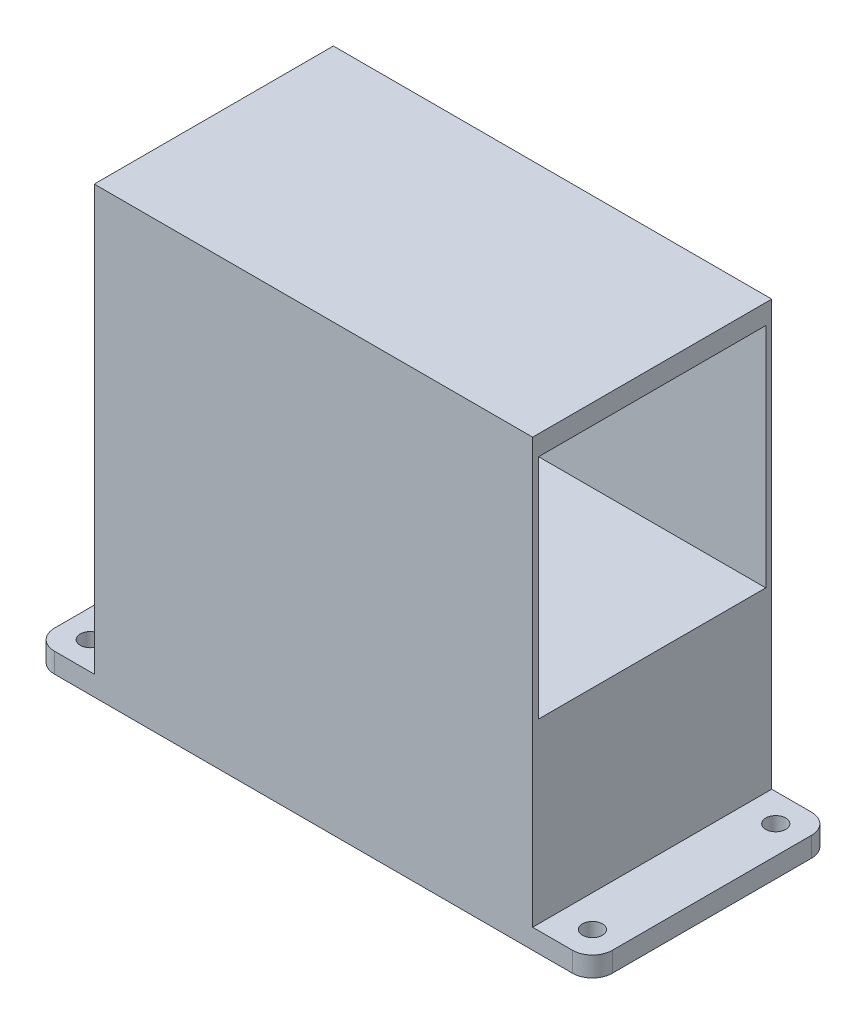
ISO-10303-21;
HEADER;
FILE_DESCRIPTION(('STEP AP214'),'2;1');
FILE_NAME('part.step','',(''),(''),'','','');
FILE_SCHEMA(('AUTOMOTIVE_DESIGN { 1 0 10303 214 1 1 1 1 }'));
ENDSEC;
DATA;
#1=APPLICATION_CONTEXT('core data for automotive mechanical design processes');
#2=APPLICATION_PROTOCOL_DEFINITION('international standard','automotive_design',2000,#1);
#3=PRODUCT_CONTEXT('',#1,'mechanical');
#4=PRODUCT('Part','Part','',(#3));
#5=PRODUCT_RELATED_PRODUCT_CATEGORY('part','',(#4));
#6=PRODUCT_DEFINITION_FORMATION('','',#4);
#7=PRODUCT_DEFINITION_CONTEXT('part definition',#1,'design');
#8=PRODUCT_DEFINITION('design','',#6,#7);
#9=PRODUCT_DEFINITION_SHAPE('','',#8);
#10=(LENGTH_UNIT() NAMED_UNIT(*) SI_UNIT(.MILLI.,.METRE.));
#11=(NAMED_UNIT(*) PLANE_ANGLE_UNIT() SI_UNIT($,.RADIAN.));
#12=(NAMED_UNIT(*) SI_UNIT($,.STERADIAN.) SOLID_ANGLE_UNIT());
#13=UNCERTAINTY_MEASURE_WITH_UNIT(LENGTH_MEASURE(1.E-05),#10,'distance_accuracy_value','');
#14=(GEOMETRIC_REPRESENTATION_CONTEXT(3) GLOBAL_UNCERTAINTY_ASSIGNED_CONTEXT((#13)) GLOBAL_UNIT_ASSIGNED_CONTEXT((#10,
#11,#12)) REPRESENTATION_CONTEXT('',''));
#15=CARTESIAN_POINT('',(0.,0.,0.));
#16=DIRECTION('',(0.,0.,1.));
#17=DIRECTION('',(1.,0.,0.));
#18=AXIS2_PLACEMENT_3D('',#15,#16,#17);
#19=CARTESIAN_POINT('',(0.,5.,0.));
#20=DIRECTION('',(0.,1.,0.));
#21=DIRECTION('',(0.,0.,1.));
#22=AXIS2_PLACEMENT_3D('',#19,#20,#21);
#23=PLANE('',#22);
#24=CARTESIAN_POINT('',(63.,5.,-22.9999999999999));
#25=DIRECTION('',(0.,1.,0.));
#26=DIRECTION('',(0.,0.,1.));
#27=AXIS2_PLACEMENT_3D('',#24,#25,#26);
#28=CIRCLE('',#27,2.49999999999999);
#29=CARTESIAN_POINT('',(63.,5.,-20.4999999999999));
#30=VERTEX_POINT('',#29);
#31=EDGE_CURVE('E490',#30,#30,#28,.T.);
#32=ORIENTED_EDGE('',*,*,#31,.F.);
#33=EDGE_LOOP('',(#32));
#34=FACE_BOUND('',#33,.T.);
#35=CARTESIAN_POINT('',(63.,5.,23.0000000000001));
#36=DIRECTION('',(0.,1.,0.));
#37=DIRECTION('',(0.,0.,1.));
#38=AXIS2_PLACEMENT_3D('',#35,#36,#37);
#39=CIRCLE('',#38,2.49999999999999);
#40=CARTESIAN_POINT('',(63.,5.,25.5000000000001));
#41=VERTEX_POINT('',#40);
#42=EDGE_CURVE('E482',#41,#41,#39,.T.);
#43=ORIENTED_EDGE('',*,*,#42,.F.);
#44=EDGE_LOOP('',(#43));
#45=FACE_BOUND('',#44,.T.);
#46=DIRECTION('',(0.,0.,-1.));
#47=VECTOR('',#46,1.);
#48=CARTESIAN_POINT('',(70.,5.,-30.));
#49=LINE('',#48,#47);
#50=CARTESIAN_POINT('',(69.9999999999989,5.,25.0000000000001));
#51=VERTEX_POINT('',#50);
#52=CARTESIAN_POINT('',(69.9999999999989,5.,-24.9999999999999));
#53=VERTEX_POINT('',#52);
#54=EDGE_CURVE('E249',#51,#53,#49,.T.);
#55=ORIENTED_EDGE('',*,*,#54,.T.);
#56=CARTESIAN_POINT('',(64.9999999999989,5.,-24.9999999999999));
#57=DIRECTION('',(0.,1.,0.));
#58=DIRECTION('',(0.,0.,1.));
#59=AXIS2_PLACEMENT_3D('',#56,#57,#58);
#60=CIRCLE('',#59,5.);
#61=CARTESIAN_POINT('',(65.,5.,-30.));
#62=VERTEX_POINT('',#61);
#63=EDGE_CURVE('E309',#53,#62,#60,.T.);
#64=ORIENTED_EDGE('',*,*,#63,.T.);
#65=DIRECTION('',(-1.,0.,0.));
#66=VECTOR('',#65,1.);
#67=CARTESIAN_POINT('',(-70.,5.,-29.9999999999956));
#68=LINE('',#67,#66);
#69=CARTESIAN_POINT('',(55.,4.99999999999989,-29.9999999999956));
#70=VERTEX_POINT('',#69);
#71=EDGE_CURVE('E255',#62,#70,#68,.T.);
#72=ORIENTED_EDGE('',*,*,#71,.T.);
#73=DIRECTION('',(0.,0.,-1.));
#74=VECTOR('',#73,1.);
#75=CARTESIAN_POINT('',(55.,5.,30.0000000000045));
#76=LINE('',#75,#74);
#77=CARTESIAN_POINT('',(55.,5.,30.0000000000045));
#78=VERTEX_POINT('',#77);
#79=EDGE_CURVE('E211',#78,#70,#76,.T.);
#80=ORIENTED_EDGE('',*,*,#79,.F.);
#81=DIRECTION('',(1.,0.,0.));
#82=VECTOR('',#81,1.);
#83=CARTESIAN_POINT('',(-70.0000000000011,5.,30.0000000000045));
#84=LINE('',#83,#82);
#85=CARTESIAN_POINT('',(65.,5.,30.));
#86=VERTEX_POINT('',#85);
#87=EDGE_CURVE('E262',#78,#86,#84,.T.);
#88=ORIENTED_EDGE('',*,*,#87,.T.);
#89=CARTESIAN_POINT('',(64.9999999999989,5.,24.9999999999999));
#90=DIRECTION('',(0.,1.,0.));
#91=DIRECTION('',(0.,0.,1.));
#92=AXIS2_PLACEMENT_3D('',#89,#90,#91);
#93=CIRCLE('',#92,5.);
#94=EDGE_CURVE('E306',#86,#51,#93,.T.);
#95=ORIENTED_EDGE('',*,*,#94,.T.);
#96=EDGE_LOOP('',(#55,#64,#72,#80,#88,#95));
#97=FACE_BOUND('',#96,.T.);
#98=ADVANCED_FACE('F49',(#34,#45,#97),#23,.T.);
#99=CARTESIAN_POINT('',(70.,5.,-30.));
#100=DIRECTION('',(-1.,0.,0.));
#101=DIRECTION('',(0.,0.,1.));
#102=AXIS2_PLACEMENT_3D('',#99,#100,#101);
#103=PLANE('',#102);
#104=DIRECTION('',(0.,0.,-1.));
#105=VECTOR('',#104,1.);
#106=CARTESIAN_POINT('',(70.,0.,-30.));
#107=LINE('',#106,#105);
#108=CARTESIAN_POINT('',(70.,0.,24.9999999999999));
#109=VERTEX_POINT('',#108);
#110=CARTESIAN_POINT('',(70.,0.,-25.0000000000001));
#111=VERTEX_POINT('',#110);
#112=EDGE_CURVE('E248',#109,#111,#107,.T.);
#113=ORIENTED_EDGE('',*,*,#112,.T.);
#114=DIRECTION('',(0.,-1.,0.));
#115=VECTOR('',#114,1.);
#116=CARTESIAN_POINT('',(69.9999999999989,5.,-24.9999999999999));
#117=LINE('',#116,#115);
#118=EDGE_CURVE('E303',#111,#53,#117,.F.);
#119=ORIENTED_EDGE('',*,*,#118,.T.);
#120=ORIENTED_EDGE('',*,*,#54,.F.);
#121=DIRECTION('',(0.,-1.,0.));
#122=VECTOR('',#121,1.);
#123=CARTESIAN_POINT('',(69.9999999999989,5.,25.0000000000001));
#124=LINE('',#123,#122);
#125=EDGE_CURVE('E299',#51,#109,#124,.T.);
#126=ORIENTED_EDGE('',*,*,#125,.T.);
#127=EDGE_LOOP('',(#113,#119,#120,#126));
#128=FACE_BOUND('',#127,.T.);
#129=ADVANCED_FACE('F354',(#128),#103,.F.);
#130=CARTESIAN_POINT('',(-70.,5.,-29.9999999999956));
#131=DIRECTION('',(0.,0.,1.));
#132=DIRECTION('',(1.,0.,0.));
#133=AXIS2_PLACEMENT_3D('',#130,#131,#132);
#134=PLANE('',#133);
#135=ORIENTED_EDGE('',*,*,#71,.F.);
#136=DIRECTION('',(0.,-1.,0.));
#137=VECTOR('',#136,1.);
#138=CARTESIAN_POINT('',(65.,5.,-30.));
#139=LINE('',#138,#137);
#140=CARTESIAN_POINT('',(65.,0.,-30.));
#141=VERTEX_POINT('',#140);
#142=EDGE_CURVE('E283',#62,#141,#139,.T.);
#143=ORIENTED_EDGE('',*,*,#142,.T.);
#144=DIRECTION('',(-1.,0.,0.));
#145=VECTOR('',#144,1.);
#146=CARTESIAN_POINT('',(-70.0000000000006,0.,-30.));
#147=LINE('',#146,#145);
#148=CARTESIAN_POINT('',(-65.0000000000006,0.,-30.0000000000042));
#149=VERTEX_POINT('',#148);
#150=EDGE_CURVE('E270',#141,#149,#147,.T.);
#151=ORIENTED_EDGE('',*,*,#150,.T.);
#152=DIRECTION('',(0.,-1.,0.));
#153=VECTOR('',#152,1.);
#154=CARTESIAN_POINT('',(-65.,5.,-30.));
#155=LINE('',#154,#153);
#156=CARTESIAN_POINT('',(-65.,5.,-30.));
#157=VERTEX_POINT('',#156);
#158=EDGE_CURVE('E266',#149,#157,#155,.F.);
#159=ORIENTED_EDGE('',*,*,#158,.T.);
#160=CARTESIAN_POINT('',(-55.0000000000005,5.,-30.));
#161=VERTEX_POINT('',#160);
#162=EDGE_CURVE('E253',#161,#157,#68,.T.);
#163=ORIENTED_EDGE('',*,*,#162,.F.);
#164=DIRECTION('',(0.,-1.,0.));
#165=VECTOR('',#164,1.);
#166=CARTESIAN_POINT('',(-55.0000000000006,111.5,-30.));
#167=LINE('',#166,#165);
#168=CARTESIAN_POINT('',(-55.0000000000006,111.5,-30.));
#169=VERTEX_POINT('',#168);
#170=EDGE_CURVE('E240',#169,#161,#167,.T.);
#171=ORIENTED_EDGE('',*,*,#170,.F.);
#172=DIRECTION('',(-1.,0.,0.));
#173=VECTOR('',#172,1.);
#174=CARTESIAN_POINT('',(-55.0000000000006,111.5,-30.));
#175=LINE('',#174,#173);
#176=CARTESIAN_POINT('',(54.9999999999989,111.5,-29.9999999999956));
#177=VERTEX_POINT('',#176);
#178=EDGE_CURVE('E216',#177,#169,#175,.T.);
#179=ORIENTED_EDGE('',*,*,#178,.F.);
#180=DIRECTION('',(0.,-1.,0.));
#181=VECTOR('',#180,1.);
#182=CARTESIAN_POINT('',(54.9999999999989,111.5,-29.9999999999956));
#183=LINE('',#182,#181);
#184=EDGE_CURVE('E244',#177,#70,#183,.T.);
#185=ORIENTED_EDGE('',*,*,#184,.T.);
#186=EDGE_LOOP('',(#135,#143,#151,#159,#163,#171,#179,#185));
#187=FACE_BOUND('',#186,.T.);
#188=ADVANCED_FACE('F346',(#187),#134,.F.);
#189=CARTESIAN_POINT('',(-70.,5.,-29.9999999999956));
#190=DIRECTION('',(1.,0.,0.));
#191=DIRECTION('',(0.,0.,-1.));
#192=AXIS2_PLACEMENT_3D('',#189,#190,#191);
#193=PLANE('',#192);
#194=DIRECTION('',(0.,0.,1.));
#195=VECTOR('',#194,1.);
#196=CARTESIAN_POINT('',(-70.0000000000006,0.,-30.));
#197=LINE('',#196,#195);
#198=CARTESIAN_POINT('',(-70.0000000000006,0.,-24.9999999999999));
#199=VERTEX_POINT('',#198);
#200=CARTESIAN_POINT('',(-70.0000000000011,0.,25.0000000000001));
#201=VERTEX_POINT('',#200);
#202=EDGE_CURVE('E274',#199,#201,#197,.T.);
#203=ORIENTED_EDGE('',*,*,#202,.T.);
#204=DIRECTION('',(0.,-1.,0.));
#205=VECTOR('',#204,1.);
#206=CARTESIAN_POINT('',(-70.0000000000011,5.,25.0000000000044));
#207=LINE('',#206,#205);
#208=CARTESIAN_POINT('',(-70.0000000000011,5.,25.0000000000044));
#209=VERTEX_POINT('',#208);
#210=EDGE_CURVE('E323',#201,#209,#207,.F.);
#211=ORIENTED_EDGE('',*,*,#210,.T.);
#212=DIRECTION('',(0.,0.,1.));
#213=VECTOR('',#212,1.);
#214=CARTESIAN_POINT('',(-70.,5.,-29.9999999999956));
#215=LINE('',#214,#213);
#216=CARTESIAN_POINT('',(-70.,5.,-24.9999999999957));
#217=VERTEX_POINT('',#216);
#218=EDGE_CURVE('E258',#217,#209,#215,.T.);
#219=ORIENTED_EDGE('',*,*,#218,.F.);
#220=DIRECTION('',(0.,-1.,0.));
#221=VECTOR('',#220,1.);
#222=CARTESIAN_POINT('',(-70.,5.,-24.9999999999957));
#223=LINE('',#222,#221);
#224=EDGE_CURVE('E319',#217,#199,#223,.T.);
#225=ORIENTED_EDGE('',*,*,#224,.T.);
#226=EDGE_LOOP('',(#203,#211,#219,#225));
#227=FACE_BOUND('',#226,.T.);
#228=ADVANCED_FACE('F338',(#227),#193,.F.);
#229=CARTESIAN_POINT('',(-70.0000000000011,5.,30.0000000000045));
#230=DIRECTION('',(0.,0.,-1.));
#231=DIRECTION('',(-1.,0.,0.));
#232=AXIS2_PLACEMENT_3D('',#229,#230,#231);
#233=PLANE('',#232);
#234=DIRECTION('',(1.,0.,0.));
#235=VECTOR('',#234,1.);
#236=CARTESIAN_POINT('',(-70.0000000000011,0.,30.));
#237=LINE('',#236,#235);
#238=CARTESIAN_POINT('',(-65.0000000000011,0.,29.9999999999956));
#239=VERTEX_POINT('',#238);
#240=CARTESIAN_POINT('',(65.,0.,29.9999999999998));
#241=VERTEX_POINT('',#240);
#242=EDGE_CURVE('E254',#239,#241,#237,.T.);
#243=ORIENTED_EDGE('',*,*,#242,.T.);
#244=DIRECTION('',(0.,-1.,0.));
#245=VECTOR('',#244,1.);
#246=CARTESIAN_POINT('',(65.,5.,30.));
#247=LINE('',#246,#245);
#248=EDGE_CURVE('E316',#241,#86,#247,.F.);
#249=ORIENTED_EDGE('',*,*,#248,.T.);
#250=ORIENTED_EDGE('',*,*,#87,.F.);
#251=DIRECTION('',(0.,-1.,0.));
#252=VECTOR('',#251,1.);
#253=CARTESIAN_POINT('',(55.,111.5,30.0000000000045));
#254=LINE('',#253,#252);
#255=CARTESIAN_POINT('',(55.,111.5,30.0000000000045));
#256=VERTEX_POINT('',#255);
#257=EDGE_CURVE('E226',#256,#78,#254,.T.);
#258=ORIENTED_EDGE('',*,*,#257,.F.);
#259=DIRECTION('',(1.,0.,0.));
#260=VECTOR('',#259,1.);
#261=CARTESIAN_POINT('',(-55.0000000000011,111.5,30.));
#262=LINE('',#261,#260);
#263=CARTESIAN_POINT('',(-55.0000000000011,111.5,30.));
#264=VERTEX_POINT('',#263);
#265=EDGE_CURVE('E223',#264,#256,#262,.T.);
#266=ORIENTED_EDGE('',*,*,#265,.F.);
#267=DIRECTION('',(0.,-1.,0.));
#268=VECTOR('',#267,1.);
#269=CARTESIAN_POINT('',(-55.0000000000011,111.5,30.));
#270=LINE('',#269,#268);
#271=CARTESIAN_POINT('',(-55.0000000000006,4.99999999999995,30.));
#272=VERTEX_POINT('',#271);
#273=EDGE_CURVE('E236',#264,#272,#270,.T.);
#274=ORIENTED_EDGE('',*,*,#273,.T.);
#275=CARTESIAN_POINT('',(-65.0000000000011,5.,30.));
#276=VERTEX_POINT('',#275);
#277=EDGE_CURVE('E263',#276,#272,#84,.T.);
#278=ORIENTED_EDGE('',*,*,#277,.F.);
#279=DIRECTION('',(0.,-1.,0.));
#280=VECTOR('',#279,1.);
#281=CARTESIAN_POINT('',(-65.0000000000011,5.,30.));
#282=LINE('',#281,#280);
#283=EDGE_CURVE('E312',#276,#239,#282,.T.);
#284=ORIENTED_EDGE('',*,*,#283,.T.);
#285=EDGE_LOOP('',(#243,#249,#250,#258,#266,#274,#278,#284));
#286=FACE_BOUND('',#285,.T.);
#287=ADVANCED_FACE('F363',(#286),#233,.F.);
#288=CARTESIAN_POINT('',(-62.9999999999999,5.,23.0000000000046));
#289=DIRECTION('',(0.,1.,0.));
#290=DIRECTION('',(0.,0.,1.));
#291=AXIS2_PLACEMENT_3D('',#288,#289,#290);
#292=CIRCLE('',#291,2.49999999999999);
#293=CARTESIAN_POINT('',(-62.9999999999999,5.,25.5000000000046));
#294=VERTEX_POINT('',#293);
#295=EDGE_CURVE('E455',#294,#294,#292,.T.);
#296=ORIENTED_EDGE('',*,*,#295,.F.);
#297=EDGE_LOOP('',(#296));
#298=FACE_BOUND('',#297,.T.);
#299=CARTESIAN_POINT('',(-63.0000000000011,5.,-22.9999999999955));
#300=DIRECTION('',(0.,1.,0.));
#301=DIRECTION('',(0.,0.,1.));
#302=AXIS2_PLACEMENT_3D('',#299,#300,#301);
#303=CIRCLE('',#302,2.49999999999999);
#304=CARTESIAN_POINT('',(-63.0000000000011,5.,-20.4999999999955));
#305=VERTEX_POINT('',#304);
#306=EDGE_CURVE('E458',#305,#305,#303,.T.);
#307=ORIENTED_EDGE('',*,*,#306,.F.);
#308=EDGE_LOOP('',(#307));
#309=FACE_BOUND('',#308,.T.);
#310=ORIENTED_EDGE('',*,*,#218,.T.);
#311=CARTESIAN_POINT('',(-65.0000000000011,5.,24.9999999999999));
#312=DIRECTION('',(0.,1.,0.));
#313=DIRECTION('',(0.,0.,1.));
#314=AXIS2_PLACEMENT_3D('',#311,#312,#313);
#315=CIRCLE('',#314,5.);
#316=EDGE_CURVE('E11',#209,#276,#315,.T.);
#317=ORIENTED_EDGE('',*,*,#316,.T.);
#318=ORIENTED_EDGE('',*,*,#277,.T.);
#319=DIRECTION('',(0.,0.,1.));
#320=VECTOR('',#319,1.);
#321=CARTESIAN_POINT('',(-55.0000000000006,4.99999999999995,30.));
#322=LINE('',#321,#320);
#323=EDGE_CURVE('E217',#161,#272,#322,.T.);
#324=ORIENTED_EDGE('',*,*,#323,.F.);
#325=ORIENTED_EDGE('',*,*,#162,.T.);
#326=CARTESIAN_POINT('',(-65.,5.,-25.0000000000001));
#327=DIRECTION('',(0.,1.,0.));
#328=DIRECTION('',(0.,0.,1.));
#329=AXIS2_PLACEMENT_3D('',#326,#327,#328);
#330=CIRCLE('',#329,5.);
#331=EDGE_CURVE('E58',#157,#217,#330,.T.);
#332=ORIENTED_EDGE('',*,*,#331,.T.);
#333=EDGE_LOOP('',(#310,#317,#318,#324,#325,#332));
#334=FACE_BOUND('',#333,.T.);
#335=ADVANCED_FACE('F331',(#298,#309,#334),#23,.T.);
#336=CARTESIAN_POINT('',(0.,0.,0.));
#337=DIRECTION('',(0.,1.,0.));
#338=DIRECTION('',(0.,0.,1.));
#339=AXIS2_PLACEMENT_3D('',#336,#337,#338);
#340=PLANE('',#339);
#341=CARTESIAN_POINT('',(63.,0.,-23.0000000000001));
#342=DIRECTION('',(0.,1.,0.));
#343=DIRECTION('',(0.,0.,1.));
#344=AXIS2_PLACEMENT_3D('',#341,#342,#343);
#345=CIRCLE('',#344,2.5);
#346=CARTESIAN_POINT('',(63.,0.,-20.5000000000001));
#347=VERTEX_POINT('',#346);
#348=EDGE_CURVE('E486',#347,#347,#345,.T.);
#349=ORIENTED_EDGE('',*,*,#348,.T.);
#350=EDGE_LOOP('',(#349));
#351=FACE_BOUND('',#350,.T.);
#352=CARTESIAN_POINT('',(63.,0.,22.9999999999999));
#353=DIRECTION('',(0.,1.,0.));
#354=DIRECTION('',(0.,0.,1.));
#355=AXIS2_PLACEMENT_3D('',#352,#353,#354);
#356=CIRCLE('',#355,2.5);
#357=CARTESIAN_POINT('',(63.,0.,25.4999999999999));
#358=VERTEX_POINT('',#357);
#359=EDGE_CURVE('E478',#358,#358,#356,.T.);
#360=ORIENTED_EDGE('',*,*,#359,.T.);
#361=EDGE_LOOP('',(#360));
#362=FACE_BOUND('',#361,.T.);
#363=CARTESIAN_POINT('',(-63.0000000000005,0.,23.0000000000001));
#364=DIRECTION('',(0.,1.,0.));
#365=DIRECTION('',(0.,0.,1.));
#366=AXIS2_PLACEMENT_3D('',#363,#364,#365);
#367=CIRCLE('',#366,2.5);
#368=CARTESIAN_POINT('',(-63.0000000000005,0.,25.5000000000001));
#369=VERTEX_POINT('',#368);
#370=EDGE_CURVE('E462',#369,#369,#367,.T.);
#371=ORIENTED_EDGE('',*,*,#370,.T.);
#372=EDGE_LOOP('',(#371));
#373=FACE_BOUND('',#372,.T.);
#374=CARTESIAN_POINT('',(-63.0000000000011,0.,-22.9999999999999));
#375=DIRECTION('',(0.,1.,0.));
#376=DIRECTION('',(0.,0.,1.));
#377=AXIS2_PLACEMENT_3D('',#374,#375,#376);
#378=CIRCLE('',#377,2.5);
#379=CARTESIAN_POINT('',(-63.0000000000011,0.,-20.4999999999999));
#380=VERTEX_POINT('',#379);
#381=EDGE_CURVE('E461',#380,#380,#378,.T.);
#382=ORIENTED_EDGE('',*,*,#381,.T.);
#383=EDGE_LOOP('',(#382));
#384=FACE_BOUND('',#383,.T.);
#385=ORIENTED_EDGE('',*,*,#150,.F.);
#386=CARTESIAN_POINT('',(64.9999999999999,0.,-25.0000000000001));
#387=DIRECTION('',(0.,1.,0.));
#388=DIRECTION('',(0.,0.,1.));
#389=AXIS2_PLACEMENT_3D('',#386,#387,#388);
#390=CIRCLE('',#389,5.);
#391=EDGE_CURVE('E296',#141,#111,#390,.F.);
#392=ORIENTED_EDGE('',*,*,#391,.T.);
#393=ORIENTED_EDGE('',*,*,#112,.F.);
#394=CARTESIAN_POINT('',(65.,0.,24.9999999999999));
#395=DIRECTION('',(0.,1.,0.));
#396=DIRECTION('',(0.,0.,1.));
#397=AXIS2_PLACEMENT_3D('',#394,#395,#396);
#398=CIRCLE('',#397,5.);
#399=EDGE_CURVE('E293',#109,#241,#398,.F.);
#400=ORIENTED_EDGE('',*,*,#399,.T.);
#401=ORIENTED_EDGE('',*,*,#242,.F.);
#402=CARTESIAN_POINT('',(-65.0000000000011,0.,24.9999999999957));
#403=DIRECTION('',(0.,1.,0.));
#404=DIRECTION('',(0.,0.,1.));
#405=AXIS2_PLACEMENT_3D('',#402,#403,#404);
#406=CIRCLE('',#405,5.);
#407=EDGE_CURVE('E290',#239,#201,#406,.F.);
#408=ORIENTED_EDGE('',*,*,#407,.T.);
#409=ORIENTED_EDGE('',*,*,#202,.F.);
#410=CARTESIAN_POINT('',(-65.0000000000006,0.,-25.0000000000044));
#411=DIRECTION('',(0.,1.,0.));
#412=DIRECTION('',(0.,0.,1.));
#413=AXIS2_PLACEMENT_3D('',#410,#411,#412);
#414=CIRCLE('',#413,5.);
#415=EDGE_CURVE('E287',#199,#149,#414,.F.);
#416=ORIENTED_EDGE('',*,*,#415,.T.);
#417=EDGE_LOOP('',(#385,#392,#393,#400,#401,#408,#409,#416));
#418=FACE_BOUND('',#417,.T.);
#419=ADVANCED_FACE('F343',(#351,#362,#373,#384,#418),#340,.F.);
#420=CARTESIAN_POINT('',(55.,111.5,30.0000000000045));
#421=DIRECTION('',(-1.,0.,0.));
#422=DIRECTION('',(0.,0.,1.));
#423=AXIS2_PLACEMENT_3D('',#420,#421,#422);
#424=PLANE('',#423);
#425=DIRECTION('',(0.,0.,1.));
#426=VECTOR('',#425,1.);
#427=CARTESIAN_POINT('',(54.9999999999989,49.5,30.0000000000045));
#428=LINE('',#427,#426);
#429=CARTESIAN_POINT('',(54.9999999999989,49.5,-28.4999999999958));
#430=VERTEX_POINT('',#429);
#431=CARTESIAN_POINT('',(54.9999999999989,49.5,28.5000000000044));
#432=VERTEX_POINT('',#431);
#433=EDGE_CURVE('E203',#430,#432,#428,.T.);
#434=ORIENTED_EDGE('',*,*,#433,.T.);
#435=DIRECTION('',(0.,1.,0.));
#436=VECTOR('',#435,1.);
#437=CARTESIAN_POINT('',(54.9999999999989,111.5,28.5000000000044));
#438=LINE('',#437,#436);
#439=CARTESIAN_POINT('',(54.9999999999989,106.5,28.5000000000044));
#440=VERTEX_POINT('',#439);
#441=EDGE_CURVE('E207',#432,#440,#438,.T.);
#442=ORIENTED_EDGE('',*,*,#441,.T.);
#443=DIRECTION('',(0.,0.,-1.));
#444=VECTOR('',#443,1.);
#445=CARTESIAN_POINT('',(55.,106.5,30.0000000000042));
#446=LINE('',#445,#444);
#447=CARTESIAN_POINT('',(54.9999999999989,106.5,-28.4999999999958));
#448=VERTEX_POINT('',#447);
#449=EDGE_CURVE('E194',#440,#448,#446,.T.);
#450=ORIENTED_EDGE('',*,*,#449,.T.);
#451=DIRECTION('',(0.,-1.,0.));
#452=VECTOR('',#451,1.);
#453=CARTESIAN_POINT('',(54.9999999999989,111.5,-28.4999999999955));
#454=LINE('',#453,#452);
#455=EDGE_CURVE('E168',#448,#430,#454,.T.);
#456=ORIENTED_EDGE('',*,*,#455,.T.);
#457=EDGE_LOOP('',(#434,#442,#450,#456));
#458=FACE_BOUND('',#457,.T.);
#459=ORIENTED_EDGE('',*,*,#79,.T.);
#460=ORIENTED_EDGE('',*,*,#184,.F.);
#461=DIRECTION('',(0.,0.,-1.));
#462=VECTOR('',#461,1.);
#463=CARTESIAN_POINT('',(55.,111.5,30.0000000000045));
#464=LINE('',#463,#462);
#465=EDGE_CURVE('E212',#256,#177,#464,.T.);
#466=ORIENTED_EDGE('',*,*,#465,.F.);
#467=ORIENTED_EDGE('',*,*,#257,.T.);
#468=EDGE_LOOP('',(#459,#460,#466,#467));
#469=FACE_BOUND('',#468,.T.);
#470=ADVANCED_FACE('F426',(#458,#469),#424,.F.);
#471=CARTESIAN_POINT('',(-55.0000000000011,111.5,30.));
#472=DIRECTION('',(1.,0.,0.));
#473=DIRECTION('',(0.,0.,-1.));
#474=AXIS2_PLACEMENT_3D('',#471,#472,#473);
#475=PLANE('',#474);
#476=DIRECTION('',(0.,0.,-1.));
#477=VECTOR('',#476,1.);
#478=CARTESIAN_POINT('',(-55.0000000000005,106.5,-28.5));
#479=LINE('',#478,#477);
#480=CARTESIAN_POINT('',(-55.0000000000011,106.5,28.5));
#481=VERTEX_POINT('',#480);
#482=CARTESIAN_POINT('',(-55.0000000000005,106.5,-28.5));
#483=VERTEX_POINT('',#482);
#484=EDGE_CURVE('E175',#481,#483,#479,.T.);
#485=ORIENTED_EDGE('',*,*,#484,.F.);
#486=DIRECTION('',(0.,1.,0.));
#487=VECTOR('',#486,1.);
#488=CARTESIAN_POINT('',(-55.0000000000006,49.5,28.5));
#489=LINE('',#488,#487);
#490=CARTESIAN_POINT('',(-55.0000000000006,49.5,28.5));
#491=VERTEX_POINT('',#490);
#492=EDGE_CURVE('E73',#491,#481,#489,.T.);
#493=ORIENTED_EDGE('',*,*,#492,.F.);
#494=DIRECTION('',(0.,0.,1.));
#495=VECTOR('',#494,1.);
#496=CARTESIAN_POINT('',(-55.0000000000005,49.5,-28.5));
#497=LINE('',#496,#495);
#498=CARTESIAN_POINT('',(-55.0000000000005,49.5,-28.5));
#499=VERTEX_POINT('',#498);
#500=EDGE_CURVE('E183',#499,#491,#497,.T.);
#501=ORIENTED_EDGE('',*,*,#500,.F.);
#502=DIRECTION('',(0.,-1.,0.));
#503=VECTOR('',#502,1.);
#504=CARTESIAN_POINT('',(-55.0000000000005,49.5,-28.5));
#505=LINE('',#504,#503);
#506=EDGE_CURVE('E165',#483,#499,#505,.T.);
#507=ORIENTED_EDGE('',*,*,#506,.F.);
#508=EDGE_LOOP('',(#485,#493,#501,#507));
#509=FACE_BOUND('',#508,.T.);
#510=ORIENTED_EDGE('',*,*,#323,.T.);
#511=ORIENTED_EDGE('',*,*,#273,.F.);
#512=DIRECTION('',(0.,0.,1.));
#513=VECTOR('',#512,1.);
#514=CARTESIAN_POINT('',(-55.0000000000011,111.5,30.));
#515=LINE('',#514,#513);
#516=EDGE_CURVE('E220',#169,#264,#515,.T.);
#517=ORIENTED_EDGE('',*,*,#516,.F.);
#518=ORIENTED_EDGE('',*,*,#170,.T.);
#519=EDGE_LOOP('',(#510,#511,#517,#518));
#520=FACE_BOUND('',#519,.T.);
#521=ADVANCED_FACE('F180',(#509,#520),#475,.F.);
#522=CARTESIAN_POINT('',(-1.11022302462516E-12,111.5,4.44089209850063E-12));
#523=DIRECTION('',(0.,-1.,0.));
#524=DIRECTION('',(0.,0.,-1.));
#525=AXIS2_PLACEMENT_3D('',#522,#523,#524);
#526=PLANE('',#525);
#527=ORIENTED_EDGE('',*,*,#465,.T.);
#528=ORIENTED_EDGE('',*,*,#178,.T.);
#529=ORIENTED_EDGE('',*,*,#516,.T.);
#530=ORIENTED_EDGE('',*,*,#265,.T.);
#531=EDGE_LOOP('',(#527,#528,#529,#530));
#532=FACE_BOUND('',#531,.T.);
#533=ADVANCED_FACE('F377',(#532),#526,.F.);
#534=CARTESIAN_POINT('',(64.9999999999989,5.,-24.9999999999999));
#535=DIRECTION('',(0.,-1.,0.));
#536=DIRECTION('',(0.,0.,-1.));
#537=AXIS2_PLACEMENT_3D('',#534,#535,#536);
#538=CYLINDRICAL_SURFACE('',#537,5.);
#539=ORIENTED_EDGE('',*,*,#63,.F.);
#540=ORIENTED_EDGE('',*,*,#118,.F.);
#541=ORIENTED_EDGE('',*,*,#391,.F.);
#542=ORIENTED_EDGE('',*,*,#142,.F.);
#543=EDGE_LOOP('',(#539,#540,#541,#542));
#544=FACE_BOUND('',#543,.T.);
#545=ADVANCED_FACE('F350',(#544),#538,.T.);
#546=CARTESIAN_POINT('',(64.9999999999989,5.,24.9999999999999));
#547=DIRECTION('',(0.,-1.,0.));
#548=DIRECTION('',(0.,0.,-1.));
#549=AXIS2_PLACEMENT_3D('',#546,#547,#548);
#550=CYLINDRICAL_SURFACE('',#549,5.);
#551=ORIENTED_EDGE('',*,*,#94,.F.);
#552=ORIENTED_EDGE('',*,*,#248,.F.);
#553=ORIENTED_EDGE('',*,*,#399,.F.);
#554=ORIENTED_EDGE('',*,*,#125,.F.);
#555=EDGE_LOOP('',(#551,#552,#553,#554));
#556=FACE_BOUND('',#555,.T.);
#557=ADVANCED_FACE('F359',(#556),#550,.T.);
#558=CARTESIAN_POINT('',(-65.0000000000011,5.,24.9999999999999));
#559=DIRECTION('',(0.,-1.,0.));
#560=DIRECTION('',(0.,0.,-1.));
#561=AXIS2_PLACEMENT_3D('',#558,#559,#560);
#562=CYLINDRICAL_SURFACE('',#561,5.);
#563=ORIENTED_EDGE('',*,*,#316,.F.);
#564=ORIENTED_EDGE('',*,*,#210,.F.);
#565=ORIENTED_EDGE('',*,*,#407,.F.);
#566=ORIENTED_EDGE('',*,*,#283,.F.);
#567=EDGE_LOOP('',(#563,#564,#565,#566));
#568=FACE_BOUND('',#567,.T.);
#569=ADVANCED_FACE('F369',(#568),#562,.T.);
#570=CARTESIAN_POINT('',(-65.,5.,-25.0000000000001));
#571=DIRECTION('',(0.,-1.,0.));
#572=DIRECTION('',(0.,0.,-1.));
#573=AXIS2_PLACEMENT_3D('',#570,#571,#572);
#574=CYLINDRICAL_SURFACE('',#573,5.);
#575=ORIENTED_EDGE('',*,*,#331,.F.);
#576=ORIENTED_EDGE('',*,*,#158,.F.);
#577=ORIENTED_EDGE('',*,*,#415,.F.);
#578=ORIENTED_EDGE('',*,*,#224,.F.);
#579=EDGE_LOOP('',(#575,#576,#577,#578));
#580=FACE_BOUND('',#579,.T.);
#581=ADVANCED_FACE('F51',(#580),#574,.T.);
#582=CARTESIAN_POINT('',(104.999999999999,49.5,28.5));
#583=DIRECTION('',(0.,0.,1.));
#584=DIRECTION('',(1.,0.,0.));
#585=AXIS2_PLACEMENT_3D('',#582,#583,#584);
#586=PLANE('',#585);
#587=DIRECTION('',(-1.,0.,0.));
#588=VECTOR('',#587,1.);
#589=CARTESIAN_POINT('',(104.999999999999,49.5,28.5));
#590=LINE('',#589,#588);
#591=EDGE_CURVE('E191',#432,#491,#590,.T.);
#592=ORIENTED_EDGE('',*,*,#591,.T.);
#593=ORIENTED_EDGE('',*,*,#492,.T.);
#594=DIRECTION('',(-1.,0.,0.));
#595=VECTOR('',#594,1.);
#596=CARTESIAN_POINT('',(105.,106.5,28.5));
#597=LINE('',#596,#595);
#598=EDGE_CURVE('E172',#440,#481,#597,.T.);
#599=ORIENTED_EDGE('',*,*,#598,.F.);
#600=ORIENTED_EDGE('',*,*,#441,.F.);
#601=EDGE_LOOP('',(#592,#593,#599,#600));
#602=FACE_BOUND('',#601,.T.);
#603=ADVANCED_FACE('F519',(#602),#586,.F.);
#604=CARTESIAN_POINT('',(104.999999999998,49.5,-28.5));
#605=DIRECTION('',(0.,-1.,0.));
#606=DIRECTION('',(0.,0.,-1.));
#607=AXIS2_PLACEMENT_3D('',#604,#605,#606);
#608=PLANE('',#607);
#609=DIRECTION('',(-1.,0.,0.));
#610=VECTOR('',#609,1.);
#611=CARTESIAN_POINT('',(104.999999999998,49.5,-28.5));
#612=LINE('',#611,#610);
#613=EDGE_CURVE('E171',#430,#499,#612,.T.);
#614=ORIENTED_EDGE('',*,*,#613,.T.);
#615=ORIENTED_EDGE('',*,*,#500,.T.);
#616=ORIENTED_EDGE('',*,*,#591,.F.);
#617=ORIENTED_EDGE('',*,*,#433,.F.);
#618=EDGE_LOOP('',(#614,#615,#616,#617));
#619=FACE_BOUND('',#618,.T.);
#620=ADVANCED_FACE('F516',(#619),#608,.F.);
#621=CARTESIAN_POINT('',(104.999999999998,49.5,-28.5));
#622=DIRECTION('',(0.,0.,-1.));
#623=DIRECTION('',(-1.,0.,0.));
#624=AXIS2_PLACEMENT_3D('',#621,#622,#623);
#625=PLANE('',#624);
#626=DIRECTION('',(-1.,0.,0.));
#627=VECTOR('',#626,1.);
#628=CARTESIAN_POINT('',(104.999999999999,106.5,-28.5));
#629=LINE('',#628,#627);
#630=EDGE_CURVE('E65',#448,#483,#629,.T.);
#631=ORIENTED_EDGE('',*,*,#630,.T.);
#632=ORIENTED_EDGE('',*,*,#506,.T.);
#633=ORIENTED_EDGE('',*,*,#613,.F.);
#634=ORIENTED_EDGE('',*,*,#455,.F.);
#635=EDGE_LOOP('',(#631,#632,#633,#634));
#636=FACE_BOUND('',#635,.T.);
#637=ADVANCED_FACE('F162',(#636),#625,.F.);
#638=CARTESIAN_POINT('',(104.999999999999,106.5,-28.5));
#639=DIRECTION('',(0.,1.,0.));
#640=DIRECTION('',(0.,0.,1.));
#641=AXIS2_PLACEMENT_3D('',#638,#639,#640);
#642=PLANE('',#641);
#643=ORIENTED_EDGE('',*,*,#598,.T.);
#644=ORIENTED_EDGE('',*,*,#484,.T.);
#645=ORIENTED_EDGE('',*,*,#630,.F.);
#646=ORIENTED_EDGE('',*,*,#449,.F.);
#647=EDGE_LOOP('',(#643,#644,#645,#646));
#648=FACE_BOUND('',#647,.T.);
#649=ADVANCED_FACE('F176',(#648),#642,.F.);
#650=CARTESIAN_POINT('',(-63.0000000000011,5.,-22.9999999999955));
#651=DIRECTION('',(0.,1.,0.));
#652=DIRECTION('',(0.,0.,1.));
#653=AXIS2_PLACEMENT_3D('',#650,#651,#652);
#654=CYLINDRICAL_SURFACE('',#653,2.49999999999999);
#655=ORIENTED_EDGE('',*,*,#381,.F.);
#656=EDGE_LOOP('',(#655));
#657=FACE_BOUND('',#656,.T.);
#658=ORIENTED_EDGE('',*,*,#306,.T.);
#659=EDGE_LOOP('',(#658));
#660=FACE_BOUND('',#659,.T.);
#661=ADVANCED_FACE('F511',(#657,#660),#654,.F.);
#662=CARTESIAN_POINT('',(-62.9999999999999,5.,23.0000000000046));
#663=DIRECTION('',(0.,1.,0.));
#664=DIRECTION('',(0.,0.,1.));
#665=AXIS2_PLACEMENT_3D('',#662,#663,#664);
#666=CYLINDRICAL_SURFACE('',#665,2.49999999999999);
#667=ORIENTED_EDGE('',*,*,#370,.F.);
#668=EDGE_LOOP('',(#667));
#669=FACE_BOUND('',#668,.T.);
#670=ORIENTED_EDGE('',*,*,#295,.T.);
#671=EDGE_LOOP('',(#670));
#672=FACE_BOUND('',#671,.T.);
#673=ADVANCED_FACE('F504',(#669,#672),#666,.F.);
#674=CARTESIAN_POINT('',(63.,5.,23.0000000000001));
#675=DIRECTION('',(0.,1.,0.));
#676=DIRECTION('',(0.,0.,1.));
#677=AXIS2_PLACEMENT_3D('',#674,#675,#676);
#678=CYLINDRICAL_SURFACE('',#677,2.5);
#679=ORIENTED_EDGE('',*,*,#359,.F.);
#680=EDGE_LOOP('',(#679));
#681=FACE_BOUND('',#680,.T.);
#682=ORIENTED_EDGE('',*,*,#42,.T.);
#683=EDGE_LOOP('',(#682));
#684=FACE_BOUND('',#683,.T.);
#685=ADVANCED_FACE('F497',(#681,#684),#678,.F.);
#686=CARTESIAN_POINT('',(63.,5.,-22.9999999999999));
#687=DIRECTION('',(0.,1.,0.));
#688=DIRECTION('',(0.,0.,1.));
#689=AXIS2_PLACEMENT_3D('',#686,#687,#688);
#690=CYLINDRICAL_SURFACE('',#689,2.5);
#691=ORIENTED_EDGE('',*,*,#348,.F.);
#692=EDGE_LOOP('',(#691));
#693=FACE_BOUND('',#692,.T.);
#694=ORIENTED_EDGE('',*,*,#31,.T.);
#695=EDGE_LOOP('',(#694));
#696=FACE_BOUND('',#695,.T.);
#697=ADVANCED_FACE('F495',(#693,#696),#690,.F.);
#698=CLOSED_SHELL('',(#98,#129,#188,#228,#287,#335,#419,#470,#521,#533,#545,#557,#569,#581,#603,
#620,#637,#649,#661,#673,#685,#697));
#699=MANIFOLD_SOLID_BREP('B2',#698);
#700=ADVANCED_BREP_SHAPE_REPRESENTATION('',(#18,#699),#14);
#701=SHAPE_DEFINITION_REPRESENTATION(#9,#700);
ENDSEC;
END-ISO-10303-21;
